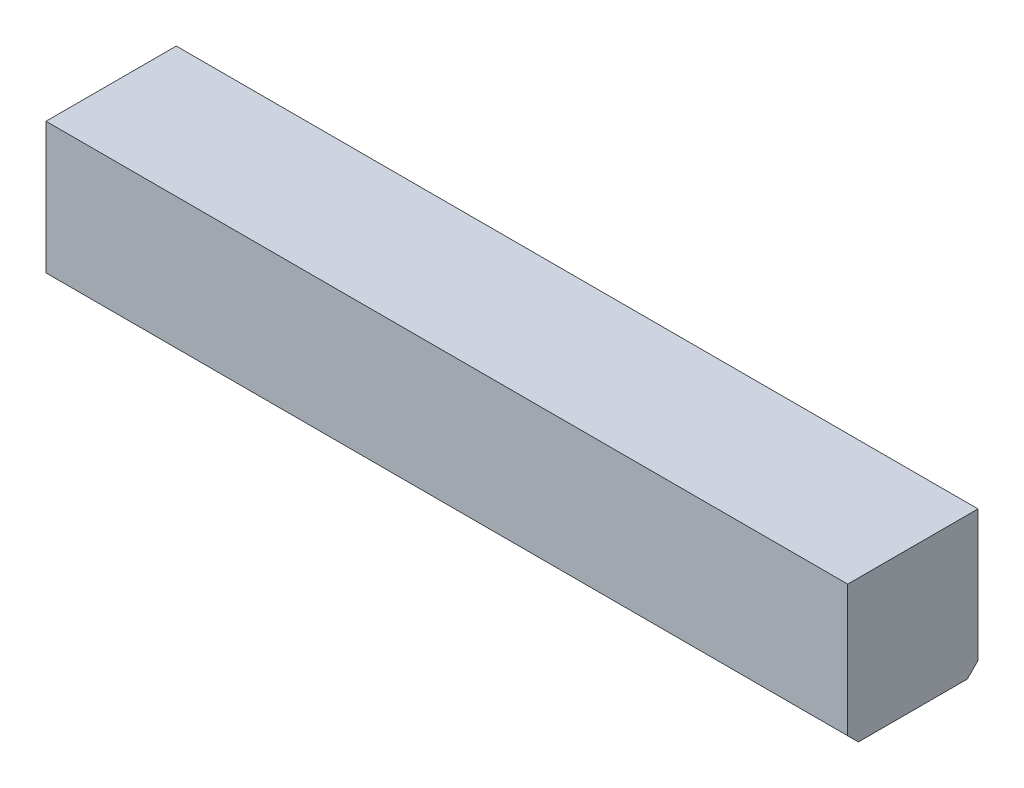
ISO-10303-21;
HEADER;
FILE_DESCRIPTION(('STEP AP214'),'2;1');
FILE_NAME('part.step','',(''),(''),'','','');
FILE_SCHEMA(('AUTOMOTIVE_DESIGN { 1 0 10303 214 1 1 1 1 }'));
ENDSEC;
DATA;
#1=APPLICATION_CONTEXT('core data for automotive mechanical design processes');
#2=APPLICATION_PROTOCOL_DEFINITION('international standard','automotive_design',2000,#1);
#3=PRODUCT_CONTEXT('',#1,'mechanical');
#4=PRODUCT('Part','Part','',(#3));
#5=PRODUCT_RELATED_PRODUCT_CATEGORY('part','',(#4));
#6=PRODUCT_DEFINITION_FORMATION('','',#4);
#7=PRODUCT_DEFINITION_CONTEXT('part definition',#1,'design');
#8=PRODUCT_DEFINITION('design','',#6,#7);
#9=PRODUCT_DEFINITION_SHAPE('','',#8);
#10=(LENGTH_UNIT() NAMED_UNIT(*) SI_UNIT(.MILLI.,.METRE.));
#11=(NAMED_UNIT(*) PLANE_ANGLE_UNIT() SI_UNIT($,.RADIAN.));
#12=(NAMED_UNIT(*) SI_UNIT($,.STERADIAN.) SOLID_ANGLE_UNIT());
#13=UNCERTAINTY_MEASURE_WITH_UNIT(LENGTH_MEASURE(1.E-05),#10,'distance_accuracy_value','');
#14=(GEOMETRIC_REPRESENTATION_CONTEXT(3) GLOBAL_UNCERTAINTY_ASSIGNED_CONTEXT((#13)) GLOBAL_UNIT_ASSIGNED_CONTEXT((#10,
#11,#12)) REPRESENTATION_CONTEXT('',''));
#15=CARTESIAN_POINT('',(0.,0.,0.));
#16=DIRECTION('',(0.,0.,1.));
#17=DIRECTION('',(1.,0.,0.));
#18=AXIS2_PLACEMENT_3D('',#15,#16,#17);
#19=CARTESIAN_POINT('',(60.,0.,8.95));
#20=DIRECTION('',(0.,1.,0.));
#21=DIRECTION('',(0.,0.,1.));
#22=AXIS2_PLACEMENT_3D('',#19,#20,#21);
#23=PLANE('',#22);
#24=DIRECTION('',(0.,0.,-1.));
#25=VECTOR('',#24,1.);
#26=CARTESIAN_POINT('',(0.,0.,8.95));
#27=LINE('',#26,#25);
#28=CARTESIAN_POINT('',(0.,0.,8.95));
#29=VERTEX_POINT('',#28);
#30=CARTESIAN_POINT('',(0.,0.,0.8));
#31=VERTEX_POINT('',#30);
#32=EDGE_CURVE('E130',#29,#31,#27,.T.);
#33=ORIENTED_EDGE('',*,*,#32,.T.);
#34=DIRECTION('',(-1.,0.,0.));
#35=VECTOR('',#34,1.);
#36=CARTESIAN_POINT('',(60.,0.,0.8));
#37=LINE('',#36,#35);
#38=CARTESIAN_POINT('',(60.,0.,0.8));
#39=VERTEX_POINT('',#38);
#40=EDGE_CURVE('E11',#39,#31,#37,.T.);
#41=ORIENTED_EDGE('',*,*,#40,.F.);
#42=DIRECTION('',(0.,0.,-1.));
#43=VECTOR('',#42,1.);
#44=CARTESIAN_POINT('',(60.,0.,8.95));
#45=LINE('',#44,#43);
#46=CARTESIAN_POINT('',(60.,0.,8.95));
#47=VERTEX_POINT('',#46);
#48=EDGE_CURVE('E140',#47,#39,#45,.T.);
#49=ORIENTED_EDGE('',*,*,#48,.F.);
#50=DIRECTION('',(-1.,0.,0.));
#51=VECTOR('',#50,1.);
#52=CARTESIAN_POINT('',(60.,0.,8.95));
#53=LINE('',#52,#51);
#54=EDGE_CURVE('E121',#47,#29,#53,.T.);
#55=ORIENTED_EDGE('',*,*,#54,.T.);
#56=EDGE_LOOP('',(#33,#41,#49,#55));
#57=FACE_BOUND('',#56,.T.);
#58=ADVANCED_FACE('F43',(#57),#23,.F.);
#59=CARTESIAN_POINT('',(60.,0.,0.8));
#60=DIRECTION('',(0.,0.707106781186547,0.707106781186547));
#61=DIRECTION('',(0.,-0.707106781186548,0.707106781186548));
#62=AXIS2_PLACEMENT_3D('',#59,#60,#61);
#63=PLANE('',#62);
#64=DIRECTION('',(0.,0.707106781186548,-0.707106781186548));
#65=VECTOR('',#64,1.);
#66=CARTESIAN_POINT('',(0.,0.,0.8));
#67=LINE('',#66,#65);
#68=CARTESIAN_POINT('',(0.,0.8,0.));
#69=VERTEX_POINT('',#68);
#70=EDGE_CURVE('E127',#31,#69,#67,.T.);
#71=ORIENTED_EDGE('',*,*,#70,.T.);
#72=DIRECTION('',(-1.,0.,0.));
#73=VECTOR('',#72,1.);
#74=CARTESIAN_POINT('',(60.,0.8,0.));
#75=LINE('',#74,#73);
#76=CARTESIAN_POINT('',(60.,0.8,0.));
#77=VERTEX_POINT('',#76);
#78=EDGE_CURVE('E51',#77,#69,#75,.T.);
#79=ORIENTED_EDGE('',*,*,#78,.F.);
#80=DIRECTION('',(0.,0.707106781186548,-0.707106781186548));
#81=VECTOR('',#80,1.);
#82=CARTESIAN_POINT('',(60.,0.,0.8));
#83=LINE('',#82,#81);
#84=EDGE_CURVE('E96',#39,#77,#83,.T.);
#85=ORIENTED_EDGE('',*,*,#84,.F.);
#86=ORIENTED_EDGE('',*,*,#40,.T.);
#87=EDGE_LOOP('',(#71,#79,#85,#86));
#88=FACE_BOUND('',#87,.T.);
#89=ADVANCED_FACE('F162',(#88),#63,.F.);
#90=CARTESIAN_POINT('',(60.,0.8,0.));
#91=DIRECTION('',(0.,0.,1.));
#92=DIRECTION('',(1.,0.,0.));
#93=AXIS2_PLACEMENT_3D('',#90,#91,#92);
#94=PLANE('',#93);
#95=DIRECTION('',(0.,1.,0.));
#96=VECTOR('',#95,1.);
#97=CARTESIAN_POINT('',(0.,0.8,0.));
#98=LINE('',#97,#96);
#99=CARTESIAN_POINT('',(0.,10.63,0.));
#100=VERTEX_POINT('',#99);
#101=EDGE_CURVE('E135',#69,#100,#98,.T.);
#102=ORIENTED_EDGE('',*,*,#101,.T.);
#103=DIRECTION('',(-1.,0.,0.));
#104=VECTOR('',#103,1.);
#105=CARTESIAN_POINT('',(60.,10.63,0.));
#106=LINE('',#105,#104);
#107=CARTESIAN_POINT('',(60.,10.63,0.));
#108=VERTEX_POINT('',#107);
#109=EDGE_CURVE('E120',#108,#100,#106,.T.);
#110=ORIENTED_EDGE('',*,*,#109,.F.);
#111=DIRECTION('',(0.,1.,0.));
#112=VECTOR('',#111,1.);
#113=CARTESIAN_POINT('',(60.,0.8,0.));
#114=LINE('',#113,#112);
#115=EDGE_CURVE('E106',#77,#108,#114,.T.);
#116=ORIENTED_EDGE('',*,*,#115,.F.);
#117=ORIENTED_EDGE('',*,*,#78,.T.);
#118=EDGE_LOOP('',(#102,#110,#116,#117));
#119=FACE_BOUND('',#118,.T.);
#120=ADVANCED_FACE('F142',(#119),#94,.F.);
#121=CARTESIAN_POINT('',(60.,10.63,0.));
#122=DIRECTION('',(0.,-1.,0.));
#123=DIRECTION('',(0.,0.,-1.));
#124=AXIS2_PLACEMENT_3D('',#121,#122,#123);
#125=PLANE('',#124);
#126=DIRECTION('',(0.,0.,1.));
#127=VECTOR('',#126,1.);
#128=CARTESIAN_POINT('',(0.,10.63,0.));
#129=LINE('',#128,#127);
#130=CARTESIAN_POINT('',(0.,10.63,9.75));
#131=VERTEX_POINT('',#130);
#132=EDGE_CURVE('E119',#100,#131,#129,.T.);
#133=ORIENTED_EDGE('',*,*,#132,.T.);
#134=DIRECTION('',(-1.,0.,0.));
#135=VECTOR('',#134,1.);
#136=CARTESIAN_POINT('',(60.,10.63,9.75));
#137=LINE('',#136,#135);
#138=CARTESIAN_POINT('',(60.,10.63,9.75));
#139=VERTEX_POINT('',#138);
#140=EDGE_CURVE('E114',#139,#131,#137,.T.);
#141=ORIENTED_EDGE('',*,*,#140,.F.);
#142=DIRECTION('',(0.,0.,1.));
#143=VECTOR('',#142,1.);
#144=CARTESIAN_POINT('',(60.,10.63,0.));
#145=LINE('',#144,#143);
#146=EDGE_CURVE('E104',#108,#139,#145,.T.);
#147=ORIENTED_EDGE('',*,*,#146,.F.);
#148=ORIENTED_EDGE('',*,*,#109,.T.);
#149=EDGE_LOOP('',(#133,#141,#147,#148));
#150=FACE_BOUND('',#149,.T.);
#151=ADVANCED_FACE('F113',(#150),#125,.F.);
#152=CARTESIAN_POINT('',(60.,10.63,9.75));
#153=DIRECTION('',(0.,0.,-1.));
#154=DIRECTION('',(-1.,0.,0.));
#155=AXIS2_PLACEMENT_3D('',#152,#153,#154);
#156=PLANE('',#155);
#157=DIRECTION('',(0.,-1.,0.));
#158=VECTOR('',#157,1.);
#159=CARTESIAN_POINT('',(0.,10.63,9.75));
#160=LINE('',#159,#158);
#161=CARTESIAN_POINT('',(0.,0.8,9.75));
#162=VERTEX_POINT('',#161);
#163=EDGE_CURVE('E85',#131,#162,#160,.T.);
#164=ORIENTED_EDGE('',*,*,#163,.T.);
#165=DIRECTION('',(-1.,0.,0.));
#166=VECTOR('',#165,1.);
#167=CARTESIAN_POINT('',(60.,0.8,9.75));
#168=LINE('',#167,#166);
#169=CARTESIAN_POINT('',(60.,0.8,9.75));
#170=VERTEX_POINT('',#169);
#171=EDGE_CURVE('E116',#170,#162,#168,.T.);
#172=ORIENTED_EDGE('',*,*,#171,.F.);
#173=DIRECTION('',(0.,-1.,0.));
#174=VECTOR('',#173,1.);
#175=CARTESIAN_POINT('',(60.,10.63,9.75));
#176=LINE('',#175,#174);
#177=EDGE_CURVE('E109',#139,#170,#176,.T.);
#178=ORIENTED_EDGE('',*,*,#177,.F.);
#179=ORIENTED_EDGE('',*,*,#140,.T.);
#180=EDGE_LOOP('',(#164,#172,#178,#179));
#181=FACE_BOUND('',#180,.T.);
#182=ADVANCED_FACE('F123',(#181),#156,.F.);
#183=CARTESIAN_POINT('',(60.,0.8,9.75));
#184=DIRECTION('',(0.,0.707106781186548,-0.707106781186547));
#185=DIRECTION('',(0.,0.707106781186547,0.707106781186548));
#186=AXIS2_PLACEMENT_3D('',#183,#184,#185);
#187=PLANE('',#186);
#188=DIRECTION('',(0.,-0.707106781186547,-0.707106781186548));
#189=VECTOR('',#188,1.);
#190=CARTESIAN_POINT('',(0.,0.8,9.75));
#191=LINE('',#190,#189);
#192=EDGE_CURVE('E88',#162,#29,#191,.T.);
#193=ORIENTED_EDGE('',*,*,#192,.T.);
#194=ORIENTED_EDGE('',*,*,#54,.F.);
#195=DIRECTION('',(0.,-0.707106781186547,-0.707106781186548));
#196=VECTOR('',#195,1.);
#197=CARTESIAN_POINT('',(60.,0.8,9.75));
#198=LINE('',#197,#196);
#199=EDGE_CURVE('E56',#170,#47,#198,.T.);
#200=ORIENTED_EDGE('',*,*,#199,.F.);
#201=ORIENTED_EDGE('',*,*,#171,.T.);
#202=EDGE_LOOP('',(#193,#194,#200,#201));
#203=FACE_BOUND('',#202,.T.);
#204=ADVANCED_FACE('F148',(#203),#187,.F.);
#205=CARTESIAN_POINT('',(60.,0.,0.));
#206=DIRECTION('',(1.,0.,0.));
#207=DIRECTION('',(0.,0.,-1.));
#208=AXIS2_PLACEMENT_3D('',#205,#206,#207);
#209=PLANE('',#208);
#210=ORIENTED_EDGE('',*,*,#48,.T.);
#211=ORIENTED_EDGE('',*,*,#84,.T.);
#212=ORIENTED_EDGE('',*,*,#115,.T.);
#213=ORIENTED_EDGE('',*,*,#146,.T.);
#214=ORIENTED_EDGE('',*,*,#177,.T.);
#215=ORIENTED_EDGE('',*,*,#199,.T.);
#216=EDGE_LOOP('',(#210,#211,#212,#213,#214,#215));
#217=FACE_BOUND('',#216,.T.);
#218=ADVANCED_FACE('F103',(#217),#209,.T.);
#219=CARTESIAN_POINT('',(0.,0.,0.));
#220=DIRECTION('',(1.,0.,0.));
#221=DIRECTION('',(0.,0.,-1.));
#222=AXIS2_PLACEMENT_3D('',#219,#220,#221);
#223=PLANE('',#222);
#224=ORIENTED_EDGE('',*,*,#32,.F.);
#225=ORIENTED_EDGE('',*,*,#192,.F.);
#226=ORIENTED_EDGE('',*,*,#163,.F.);
#227=ORIENTED_EDGE('',*,*,#132,.F.);
#228=ORIENTED_EDGE('',*,*,#101,.F.);
#229=ORIENTED_EDGE('',*,*,#70,.F.);
#230=EDGE_LOOP('',(#224,#225,#226,#227,#228,#229));
#231=FACE_BOUND('',#230,.T.);
#232=ADVANCED_FACE('F147',(#231),#223,.F.);
#233=CLOSED_SHELL('',(#58,#89,#120,#151,#182,#204,#218,#232));
#234=MANIFOLD_SOLID_BREP('B2',#233);
#235=ADVANCED_BREP_SHAPE_REPRESENTATION('',(#18,#234),#14);
#236=SHAPE_DEFINITION_REPRESENTATION(#9,#235);
ENDSEC;
END-ISO-10303-21;
